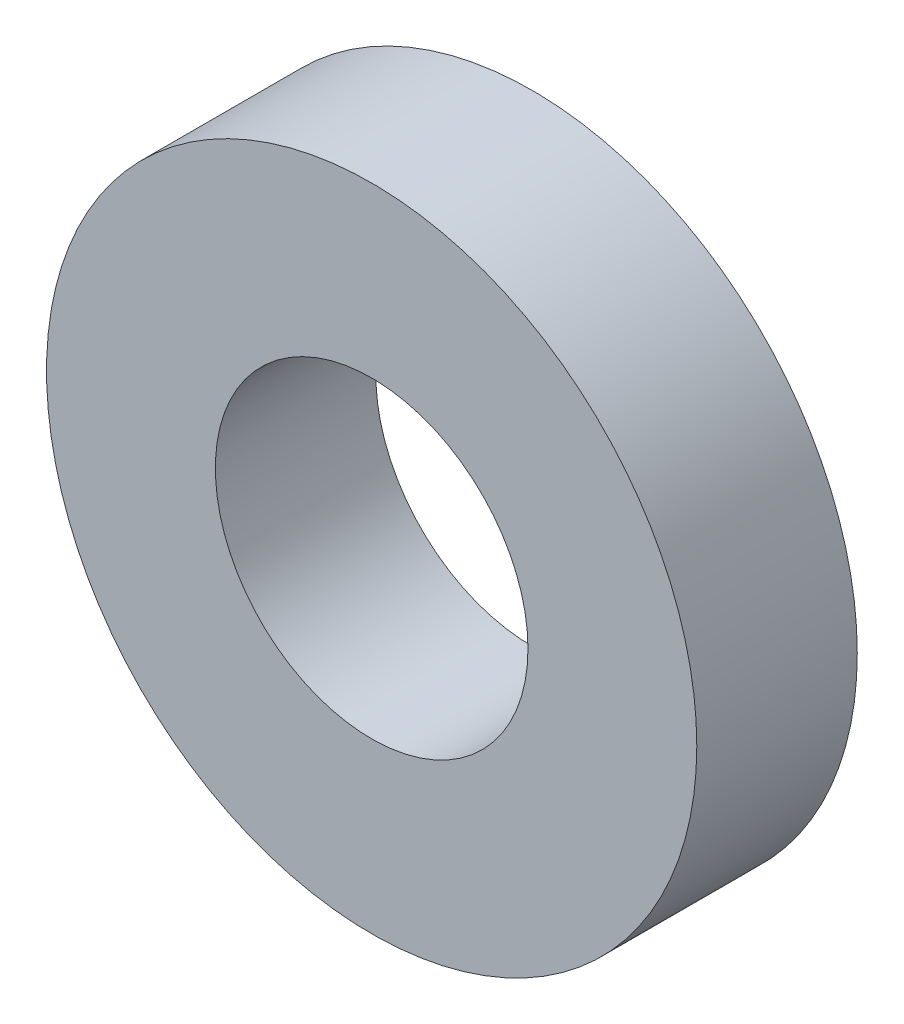
ISO-10303-21;
HEADER;
FILE_DESCRIPTION(('STEP AP214'),'2;1');
FILE_NAME('part.step','',(''),(''),'','','');
FILE_SCHEMA(('AUTOMOTIVE_DESIGN { 1 0 10303 214 1 1 1 1 }'));
ENDSEC;
DATA;
#1=APPLICATION_CONTEXT('core data for automotive mechanical design processes');
#2=APPLICATION_PROTOCOL_DEFINITION('international standard','automotive_design',2000,#1);
#3=PRODUCT_CONTEXT('',#1,'mechanical');
#4=PRODUCT('Part','Part','',(#3));
#5=PRODUCT_RELATED_PRODUCT_CATEGORY('part','',(#4));
#6=PRODUCT_DEFINITION_FORMATION('','',#4);
#7=PRODUCT_DEFINITION_CONTEXT('part definition',#1,'design');
#8=PRODUCT_DEFINITION('design','',#6,#7);
#9=PRODUCT_DEFINITION_SHAPE('','',#8);
#10=(LENGTH_UNIT() NAMED_UNIT(*) SI_UNIT(.MILLI.,.METRE.));
#11=(NAMED_UNIT(*) PLANE_ANGLE_UNIT() SI_UNIT($,.RADIAN.));
#12=(NAMED_UNIT(*) SI_UNIT($,.STERADIAN.) SOLID_ANGLE_UNIT());
#13=UNCERTAINTY_MEASURE_WITH_UNIT(LENGTH_MEASURE(1.E-05),#10,'distance_accuracy_value','');
#14=(GEOMETRIC_REPRESENTATION_CONTEXT(3) GLOBAL_UNCERTAINTY_ASSIGNED_CONTEXT((#13)) GLOBAL_UNIT_ASSIGNED_CONTEXT((#10,
#11,#12)) REPRESENTATION_CONTEXT('',''));
#15=CARTESIAN_POINT('',(0.,0.,0.));
#16=DIRECTION('',(0.,0.,1.));
#17=DIRECTION('',(1.,0.,0.));
#18=AXIS2_PLACEMENT_3D('',#15,#16,#17);
#19=CARTESIAN_POINT('',(0.,0.,-1.9558));
#20=DIRECTION('',(0.,0.,1.));
#21=DIRECTION('',(1.,0.,0.));
#22=AXIS2_PLACEMENT_3D('',#19,#20,#21);
#23=CYLINDRICAL_SURFACE('',#22,3.9624);
#24=CARTESIAN_POINT('',(0.,0.,-1.9558));
#25=DIRECTION('',(0.,0.,1.));
#26=DIRECTION('',(1.,0.,0.));
#27=AXIS2_PLACEMENT_3D('',#24,#25,#26);
#28=CIRCLE('',#27,3.9624);
#29=CARTESIAN_POINT('',(3.9624,0.,-1.9558));
#30=VERTEX_POINT('',#29);
#31=EDGE_CURVE('E10',#30,#30,#28,.T.);
#32=ORIENTED_EDGE('',*,*,#31,.T.);
#33=EDGE_LOOP('',(#32));
#34=FACE_BOUND('',#33,.T.);
#35=CARTESIAN_POINT('',(0.,0.,0.));
#36=DIRECTION('',(0.,0.,1.));
#37=DIRECTION('',(1.,0.,0.));
#38=AXIS2_PLACEMENT_3D('',#35,#36,#37);
#39=CIRCLE('',#38,3.9624);
#40=CARTESIAN_POINT('',(3.9624,0.,0.));
#41=VERTEX_POINT('',#40);
#42=EDGE_CURVE('E32',#41,#41,#39,.T.);
#43=ORIENTED_EDGE('',*,*,#42,.F.);
#44=EDGE_LOOP('',(#43));
#45=FACE_BOUND('',#44,.T.);
#46=ADVANCED_FACE('F29',(#34,#45),#23,.T.);
#47=CARTESIAN_POINT('',(0.,0.,-1.9558));
#48=DIRECTION('',(0.,0.,1.));
#49=DIRECTION('',(1.,0.,0.));
#50=AXIS2_PLACEMENT_3D('',#47,#48,#49);
#51=PLANE('',#50);
#52=CARTESIAN_POINT('',(0.,0.,-1.9558));
#53=DIRECTION('',(0.,0.,1.));
#54=DIRECTION('',(1.,0.,0.));
#55=AXIS2_PLACEMENT_3D('',#52,#53,#54);
#56=CIRCLE('',#55,1.905);
#57=CARTESIAN_POINT('',(1.905,0.,-1.9558));
#58=VERTEX_POINT('',#57);
#59=EDGE_CURVE('E39',#58,#58,#56,.T.);
#60=ORIENTED_EDGE('',*,*,#59,.T.);
#61=EDGE_LOOP('',(#60));
#62=FACE_BOUND('',#61,.T.);
#63=ORIENTED_EDGE('',*,*,#31,.F.);
#64=EDGE_LOOP('',(#63));
#65=FACE_BOUND('',#64,.T.);
#66=ADVANCED_FACE('F47',(#62,#65),#51,.F.);
#67=CARTESIAN_POINT('',(0.,0.,0.));
#68=DIRECTION('',(0.,0.,1.));
#69=DIRECTION('',(1.,0.,0.));
#70=AXIS2_PLACEMENT_3D('',#67,#68,#69);
#71=PLANE('',#70);
#72=CARTESIAN_POINT('',(0.,0.,0.));
#73=DIRECTION('',(0.,0.,1.));
#74=DIRECTION('',(1.,0.,0.));
#75=AXIS2_PLACEMENT_3D('',#72,#73,#74);
#76=CIRCLE('',#75,1.905);
#77=CARTESIAN_POINT('',(1.905,0.,0.));
#78=VERTEX_POINT('',#77);
#79=EDGE_CURVE('E41',#78,#78,#76,.T.);
#80=ORIENTED_EDGE('',*,*,#79,.F.);
#81=EDGE_LOOP('',(#80));
#82=FACE_BOUND('',#81,.T.);
#83=ORIENTED_EDGE('',*,*,#42,.T.);
#84=EDGE_LOOP('',(#83));
#85=FACE_BOUND('',#84,.T.);
#86=ADVANCED_FACE('F53',(#82,#85),#71,.T.);
#87=CARTESIAN_POINT('',(0.,0.,-1.9558));
#88=DIRECTION('',(0.,0.,1.));
#89=DIRECTION('',(1.,0.,0.));
#90=AXIS2_PLACEMENT_3D('',#87,#88,#89);
#91=CYLINDRICAL_SURFACE('',#90,1.905);
#92=ORIENTED_EDGE('',*,*,#59,.F.);
#93=EDGE_LOOP('',(#92));
#94=FACE_BOUND('',#93,.T.);
#95=ORIENTED_EDGE('',*,*,#79,.T.);
#96=EDGE_LOOP('',(#95));
#97=FACE_BOUND('',#96,.T.);
#98=ADVANCED_FACE('F50',(#94,#97),#91,.F.);
#99=CLOSED_SHELL('',(#46,#66,#86,#98));
#100=MANIFOLD_SOLID_BREP('B2',#99);
#101=ADVANCED_BREP_SHAPE_REPRESENTATION('',(#18,#100),#14);
#102=SHAPE_DEFINITION_REPRESENTATION(#9,#101);
ENDSEC;
END-ISO-10303-21;
